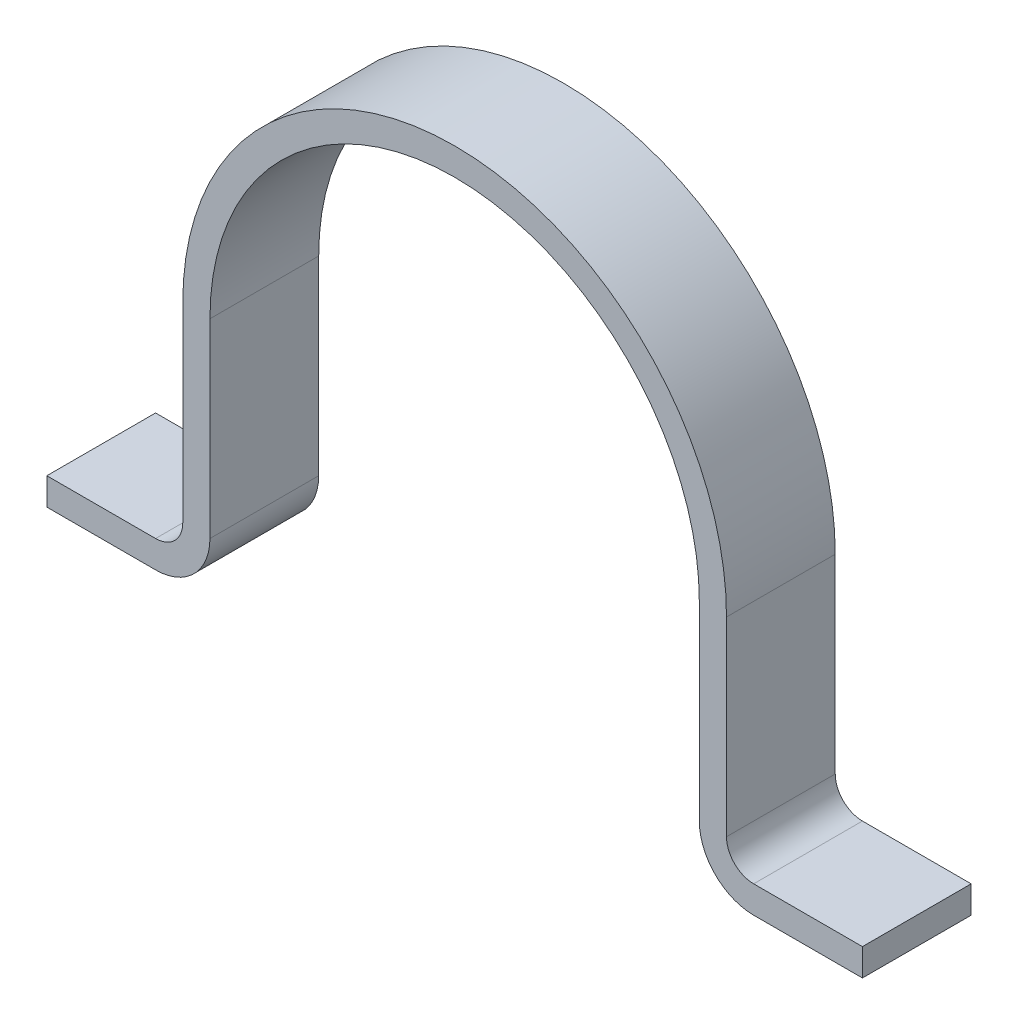
ISO-10303-21;
HEADER;
FILE_DESCRIPTION(('STEP AP214'),'2;1');
FILE_NAME('part.step','',(''),(''),'','','');
FILE_SCHEMA(('AUTOMOTIVE_DESIGN { 1 0 10303 214 1 1 1 1 }'));
ENDSEC;
DATA;
#1=APPLICATION_CONTEXT('core data for automotive mechanical design processes');
#2=APPLICATION_PROTOCOL_DEFINITION('international standard','automotive_design',2000,#1);
#3=PRODUCT_CONTEXT('',#1,'mechanical');
#4=PRODUCT('Part','Part','',(#3));
#5=PRODUCT_RELATED_PRODUCT_CATEGORY('part','',(#4));
#6=PRODUCT_DEFINITION_FORMATION('','',#4);
#7=PRODUCT_DEFINITION_CONTEXT('part definition',#1,'design');
#8=PRODUCT_DEFINITION('design','',#6,#7);
#9=PRODUCT_DEFINITION_SHAPE('','',#8);
#10=(LENGTH_UNIT() NAMED_UNIT(*) SI_UNIT(.MILLI.,.METRE.));
#11=(NAMED_UNIT(*) PLANE_ANGLE_UNIT() SI_UNIT($,.RADIAN.));
#12=(NAMED_UNIT(*) SI_UNIT($,.STERADIAN.) SOLID_ANGLE_UNIT());
#13=UNCERTAINTY_MEASURE_WITH_UNIT(LENGTH_MEASURE(1.E-05),#10,'distance_accuracy_value','');
#14=(GEOMETRIC_REPRESENTATION_CONTEXT(3) GLOBAL_UNCERTAINTY_ASSIGNED_CONTEXT((#13)) GLOBAL_UNIT_ASSIGNED_CONTEXT((#10,
#11,#12)) REPRESENTATION_CONTEXT('',''));
#15=CARTESIAN_POINT('',(0.,0.,0.));
#16=DIRECTION('',(0.,0.,1.));
#17=DIRECTION('',(1.,0.,0.));
#18=AXIS2_PLACEMENT_3D('',#15,#16,#17);
#19=CARTESIAN_POINT('',(22.5,0.0245064890224917,10.));
#20=DIRECTION('',(0.,0.,-1.));
#21=DIRECTION('',(-1.,0.,0.));
#22=AXIS2_PLACEMENT_3D('',#19,#20,#21);
#23=CYLINDRICAL_SURFACE('',#22,22.5000133459517);
#24=CARTESIAN_POINT('',(22.5,0.0245064890224917,0.));
#25=DIRECTION('',(0.,0.,-1.));
#26=DIRECTION('',(-1.,0.,0.));
#27=AXIS2_PLACEMENT_3D('',#24,#25,#26);
#28=CIRCLE('',#27,22.5000133459517);
#29=CARTESIAN_POINT('',(0.,0.,0.));
#30=VERTEX_POINT('',#29);
#31=CARTESIAN_POINT('',(45.,0.,0.));
#32=VERTEX_POINT('',#31);
#33=EDGE_CURVE('E177',#30,#32,#28,.T.);
#34=ORIENTED_EDGE('',*,*,#33,.T.);
#35=DIRECTION('',(0.,0.,-1.));
#36=VECTOR('',#35,1.);
#37=CARTESIAN_POINT('',(45.,0.,10.));
#38=LINE('',#37,#36);
#39=CARTESIAN_POINT('',(45.,0.,10.));
#40=VERTEX_POINT('',#39);
#41=EDGE_CURVE('E11',#40,#32,#38,.T.);
#42=ORIENTED_EDGE('',*,*,#41,.F.);
#43=CARTESIAN_POINT('',(22.5,0.0245064890224917,10.));
#44=DIRECTION('',(0.,0.,-1.));
#45=DIRECTION('',(-1.,0.,0.));
#46=AXIS2_PLACEMENT_3D('',#43,#44,#45);
#47=CIRCLE('',#46,22.5000133459517);
#48=CARTESIAN_POINT('',(0.,0.,10.));
#49=VERTEX_POINT('',#48);
#50=EDGE_CURVE('E207',#49,#40,#47,.T.);
#51=ORIENTED_EDGE('',*,*,#50,.F.);
#52=DIRECTION('',(0.,0.,-1.));
#53=VECTOR('',#52,1.);
#54=CARTESIAN_POINT('',(0.,0.,10.));
#55=LINE('',#54,#53);
#56=EDGE_CURVE('E173',#49,#30,#55,.T.);
#57=ORIENTED_EDGE('',*,*,#56,.T.);
#58=EDGE_LOOP('',(#34,#42,#51,#57));
#59=FACE_BOUND('',#58,.T.);
#60=ADVANCED_FACE('F33',(#59),#23,.F.);
#61=CARTESIAN_POINT('',(45.,0.,10.));
#62=DIRECTION('',(1.,0.,0.));
#63=DIRECTION('',(0.,1.,0.));
#64=AXIS2_PLACEMENT_3D('',#61,#62,#63);
#65=PLANE('',#64);
#66=DIRECTION('',(0.,-1.,0.));
#67=VECTOR('',#66,1.);
#68=CARTESIAN_POINT('',(45.,0.,0.));
#69=LINE('',#68,#67);
#70=CARTESIAN_POINT('',(45.,-17.5,0.));
#71=VERTEX_POINT('',#70);
#72=EDGE_CURVE('E180',#32,#71,#69,.T.);
#73=ORIENTED_EDGE('',*,*,#72,.T.);
#74=DIRECTION('',(0.,0.,-1.));
#75=VECTOR('',#74,1.);
#76=CARTESIAN_POINT('',(45.,-17.5,10.));
#77=LINE('',#76,#75);
#78=CARTESIAN_POINT('',(45.,-17.5,10.));
#79=VERTEX_POINT('',#78);
#80=EDGE_CURVE('E41',#79,#71,#77,.T.);
#81=ORIENTED_EDGE('',*,*,#80,.F.);
#82=DIRECTION('',(0.,-1.,0.));
#83=VECTOR('',#82,1.);
#84=CARTESIAN_POINT('',(45.,0.,10.));
#85=LINE('',#84,#83);
#86=EDGE_CURVE('E116',#40,#79,#85,.T.);
#87=ORIENTED_EDGE('',*,*,#86,.F.);
#88=ORIENTED_EDGE('',*,*,#41,.T.);
#89=EDGE_LOOP('',(#73,#81,#87,#88));
#90=FACE_BOUND('',#89,.T.);
#91=ADVANCED_FACE('F305',(#90),#65,.F.);
#92=CARTESIAN_POINT('',(50.,-17.5,10.));
#93=DIRECTION('',(0.,0.,-1.));
#94=DIRECTION('',(-1.,0.,0.));
#95=AXIS2_PLACEMENT_3D('',#92,#93,#94);
#96=CYLINDRICAL_SURFACE('',#95,5.);
#97=CARTESIAN_POINT('',(50.,-17.5,0.));
#98=DIRECTION('',(0.,0.,1.));
#99=DIRECTION('',(1.,0.,0.));
#100=AXIS2_PLACEMENT_3D('',#97,#98,#99);
#101=CIRCLE('',#100,5.);
#102=CARTESIAN_POINT('',(50.,-22.5,0.));
#103=VERTEX_POINT('',#102);
#104=EDGE_CURVE('E182',#71,#103,#101,.T.);
#105=ORIENTED_EDGE('',*,*,#104,.T.);
#106=DIRECTION('',(0.,0.,-1.));
#107=VECTOR('',#106,1.);
#108=CARTESIAN_POINT('',(50.,-22.5,10.));
#109=LINE('',#108,#107);
#110=CARTESIAN_POINT('',(50.,-22.5,10.));
#111=VERTEX_POINT('',#110);
#112=EDGE_CURVE('E238',#111,#103,#109,.T.);
#113=ORIENTED_EDGE('',*,*,#112,.F.);
#114=CARTESIAN_POINT('',(50.,-17.5,10.));
#115=DIRECTION('',(0.,0.,1.));
#116=DIRECTION('',(1.,0.,0.));
#117=AXIS2_PLACEMENT_3D('',#114,#115,#116);
#118=CIRCLE('',#117,5.);
#119=EDGE_CURVE('E246',#79,#111,#118,.T.);
#120=ORIENTED_EDGE('',*,*,#119,.F.);
#121=ORIENTED_EDGE('',*,*,#80,.T.);
#122=EDGE_LOOP('',(#105,#113,#120,#121));
#123=FACE_BOUND('',#122,.T.);
#124=ADVANCED_FACE('F244',(#123),#96,.T.);
#125=CARTESIAN_POINT('',(50.,-22.5,10.));
#126=DIRECTION('',(0.,1.,0.));
#127=DIRECTION('',(0.,0.,1.));
#128=AXIS2_PLACEMENT_3D('',#125,#126,#127);
#129=PLANE('',#128);
#130=DIRECTION('',(1.,0.,0.));
#131=VECTOR('',#130,1.);
#132=CARTESIAN_POINT('',(50.,-22.5,0.));
#133=LINE('',#132,#131);
#134=CARTESIAN_POINT('',(60.,-22.5,0.));
#135=VERTEX_POINT('',#134);
#136=EDGE_CURVE('E184',#103,#135,#133,.T.);
#137=ORIENTED_EDGE('',*,*,#136,.T.);
#138=DIRECTION('',(0.,0.,-1.));
#139=VECTOR('',#138,1.);
#140=CARTESIAN_POINT('',(60.,-22.5,10.));
#141=LINE('',#140,#139);
#142=CARTESIAN_POINT('',(60.,-22.5,10.));
#143=VERTEX_POINT('',#142);
#144=EDGE_CURVE('E235',#143,#135,#141,.T.);
#145=ORIENTED_EDGE('',*,*,#144,.F.);
#146=DIRECTION('',(1.,0.,0.));
#147=VECTOR('',#146,1.);
#148=CARTESIAN_POINT('',(50.,-22.5,10.));
#149=LINE('',#148,#147);
#150=EDGE_CURVE('E264',#111,#143,#149,.T.);
#151=ORIENTED_EDGE('',*,*,#150,.F.);
#152=ORIENTED_EDGE('',*,*,#112,.T.);
#153=EDGE_LOOP('',(#137,#145,#151,#152));
#154=FACE_BOUND('',#153,.T.);
#155=ADVANCED_FACE('F255',(#154),#129,.F.);
#156=CARTESIAN_POINT('',(60.,-22.5,10.));
#157=DIRECTION('',(-1.,0.,0.));
#158=DIRECTION('',(0.,0.,1.));
#159=AXIS2_PLACEMENT_3D('',#156,#157,#158);
#160=PLANE('',#159);
#161=DIRECTION('',(0.,1.,0.));
#162=VECTOR('',#161,1.);
#163=CARTESIAN_POINT('',(60.,-22.5,0.));
#164=LINE('',#163,#162);
#165=CARTESIAN_POINT('',(60.,-20.,0.));
#166=VERTEX_POINT('',#165);
#167=EDGE_CURVE('E186',#135,#166,#164,.T.);
#168=ORIENTED_EDGE('',*,*,#167,.T.);
#169=DIRECTION('',(0.,0.,-1.));
#170=VECTOR('',#169,1.);
#171=CARTESIAN_POINT('',(60.,-20.,10.));
#172=LINE('',#171,#170);
#173=CARTESIAN_POINT('',(60.,-20.,10.));
#174=VERTEX_POINT('',#173);
#175=EDGE_CURVE('E232',#174,#166,#172,.T.);
#176=ORIENTED_EDGE('',*,*,#175,.F.);
#177=DIRECTION('',(0.,1.,0.));
#178=VECTOR('',#177,1.);
#179=CARTESIAN_POINT('',(60.,-22.5,10.));
#180=LINE('',#179,#178);
#181=EDGE_CURVE('E261',#143,#174,#180,.T.);
#182=ORIENTED_EDGE('',*,*,#181,.F.);
#183=ORIENTED_EDGE('',*,*,#144,.T.);
#184=EDGE_LOOP('',(#168,#176,#182,#183));
#185=FACE_BOUND('',#184,.T.);
#186=ADVANCED_FACE('F259',(#185),#160,.F.);
#187=CARTESIAN_POINT('',(50.,-20.,10.));
#188=DIRECTION('',(0.,-1.,0.));
#189=DIRECTION('',(0.,0.,-1.));
#190=AXIS2_PLACEMENT_3D('',#187,#188,#189);
#191=PLANE('',#190);
#192=DIRECTION('',(-1.,0.,0.));
#193=VECTOR('',#192,1.);
#194=CARTESIAN_POINT('',(50.,-20.,0.));
#195=LINE('',#194,#193);
#196=CARTESIAN_POINT('',(50.,-20.,0.));
#197=VERTEX_POINT('',#196);
#198=EDGE_CURVE('E188',#166,#197,#195,.T.);
#199=ORIENTED_EDGE('',*,*,#198,.T.);
#200=DIRECTION('',(0.,0.,-1.));
#201=VECTOR('',#200,1.);
#202=CARTESIAN_POINT('',(50.,-20.,10.));
#203=LINE('',#202,#201);
#204=CARTESIAN_POINT('',(50.,-20.,10.));
#205=VERTEX_POINT('',#204);
#206=EDGE_CURVE('E229',#205,#197,#203,.T.);
#207=ORIENTED_EDGE('',*,*,#206,.F.);
#208=DIRECTION('',(-1.,0.,0.));
#209=VECTOR('',#208,1.);
#210=CARTESIAN_POINT('',(50.,-20.,10.));
#211=LINE('',#210,#209);
#212=EDGE_CURVE('E263',#174,#205,#211,.T.);
#213=ORIENTED_EDGE('',*,*,#212,.F.);
#214=ORIENTED_EDGE('',*,*,#175,.T.);
#215=EDGE_LOOP('',(#199,#207,#213,#214));
#216=FACE_BOUND('',#215,.T.);
#217=ADVANCED_FACE('F318',(#216),#191,.F.);
#218=CARTESIAN_POINT('',(50.,-17.5,10.));
#219=DIRECTION('',(0.,0.,-1.));
#220=DIRECTION('',(-1.,0.,0.));
#221=AXIS2_PLACEMENT_3D('',#218,#219,#220);
#222=CYLINDRICAL_SURFACE('',#221,2.5);
#223=CARTESIAN_POINT('',(50.,-17.5,0.));
#224=DIRECTION('',(0.,0.,-1.));
#225=DIRECTION('',(1.,0.,0.));
#226=AXIS2_PLACEMENT_3D('',#223,#224,#225);
#227=CIRCLE('',#226,2.5);
#228=CARTESIAN_POINT('',(47.5,-17.5,0.));
#229=VERTEX_POINT('',#228);
#230=EDGE_CURVE('E190',#197,#229,#227,.T.);
#231=ORIENTED_EDGE('',*,*,#230,.T.);
#232=DIRECTION('',(0.,0.,-1.));
#233=VECTOR('',#232,1.);
#234=CARTESIAN_POINT('',(47.5,-17.5,10.));
#235=LINE('',#234,#233);
#236=CARTESIAN_POINT('',(47.5,-17.5,10.));
#237=VERTEX_POINT('',#236);
#238=EDGE_CURVE('E226',#237,#229,#235,.T.);
#239=ORIENTED_EDGE('',*,*,#238,.F.);
#240=CARTESIAN_POINT('',(50.,-17.5,10.));
#241=DIRECTION('',(0.,0.,-1.));
#242=DIRECTION('',(1.,0.,0.));
#243=AXIS2_PLACEMENT_3D('',#240,#241,#242);
#244=CIRCLE('',#243,2.5);
#245=EDGE_CURVE('E266',#205,#237,#244,.T.);
#246=ORIENTED_EDGE('',*,*,#245,.F.);
#247=ORIENTED_EDGE('',*,*,#206,.T.);
#248=EDGE_LOOP('',(#231,#239,#246,#247));
#249=FACE_BOUND('',#248,.T.);
#250=ADVANCED_FACE('F321',(#249),#222,.F.);
#251=CARTESIAN_POINT('',(47.5,-0.0013256181794197,10.));
#252=DIRECTION('',(-1.,0.,0.));
#253=DIRECTION('',(0.,0.,1.));
#254=AXIS2_PLACEMENT_3D('',#251,#252,#253);
#255=PLANE('',#254);
#256=DIRECTION('',(0.,1.,0.));
#257=VECTOR('',#256,1.);
#258=CARTESIAN_POINT('',(47.5,-0.0013256181794197,0.));
#259=LINE('',#258,#257);
#260=CARTESIAN_POINT('',(47.5,-0.00132561817942583,0.));
#261=VERTEX_POINT('',#260);
#262=EDGE_CURVE('E192',#229,#261,#259,.T.);
#263=ORIENTED_EDGE('',*,*,#262,.T.);
#264=DIRECTION('',(0.,0.,-1.));
#265=VECTOR('',#264,1.);
#266=CARTESIAN_POINT('',(47.5,-0.00132561817942583,10.));
#267=LINE('',#266,#265);
#268=CARTESIAN_POINT('',(47.5,-0.00132561817942583,10.));
#269=VERTEX_POINT('',#268);
#270=EDGE_CURVE('E223',#269,#261,#267,.T.);
#271=ORIENTED_EDGE('',*,*,#270,.F.);
#272=DIRECTION('',(0.,1.,0.));
#273=VECTOR('',#272,1.);
#274=CARTESIAN_POINT('',(47.5,-0.0013256181794197,10.));
#275=LINE('',#274,#273);
#276=EDGE_CURVE('E272',#237,#269,#275,.T.);
#277=ORIENTED_EDGE('',*,*,#276,.F.);
#278=ORIENTED_EDGE('',*,*,#238,.T.);
#279=EDGE_LOOP('',(#263,#271,#277,#278));
#280=FACE_BOUND('',#279,.T.);
#281=ADVANCED_FACE('F325',(#280),#255,.F.);
#282=CARTESIAN_POINT('',(22.5,0.0245064890224917,10.));
#283=DIRECTION('',(0.,0.,-1.));
#284=DIRECTION('',(-1.,0.,0.));
#285=AXIS2_PLACEMENT_3D('',#282,#283,#284);
#286=CYLINDRICAL_SURFACE('',#285,25.0000133459517);
#287=CARTESIAN_POINT('',(22.5,0.0245064890224917,0.));
#288=DIRECTION('',(0.,0.,1.));
#289=DIRECTION('',(-1.,0.,0.));
#290=AXIS2_PLACEMENT_3D('',#287,#288,#289);
#291=CIRCLE('',#290,25.0000133459517);
#292=CARTESIAN_POINT('',(-2.5,-0.00132561818277739,0.));
#293=VERTEX_POINT('',#292);
#294=EDGE_CURVE('E194',#261,#293,#291,.T.);
#295=ORIENTED_EDGE('',*,*,#294,.T.);
#296=DIRECTION('',(0.,0.,-1.));
#297=VECTOR('',#296,1.);
#298=CARTESIAN_POINT('',(-2.5,-0.00132561818277739,10.));
#299=LINE('',#298,#297);
#300=CARTESIAN_POINT('',(-2.5,-0.00132561818277739,10.));
#301=VERTEX_POINT('',#300);
#302=EDGE_CURVE('E220',#301,#293,#299,.T.);
#303=ORIENTED_EDGE('',*,*,#302,.F.);
#304=CARTESIAN_POINT('',(22.5,0.0245064890224917,10.));
#305=DIRECTION('',(0.,0.,1.));
#306=DIRECTION('',(-1.,0.,0.));
#307=AXIS2_PLACEMENT_3D('',#304,#305,#306);
#308=CIRCLE('',#307,25.0000133459517);
#309=EDGE_CURVE('E274',#269,#301,#308,.T.);
#310=ORIENTED_EDGE('',*,*,#309,.F.);
#311=ORIENTED_EDGE('',*,*,#270,.T.);
#312=EDGE_LOOP('',(#295,#303,#310,#311));
#313=FACE_BOUND('',#312,.T.);
#314=ADVANCED_FACE('F329',(#313),#286,.T.);
#315=CARTESIAN_POINT('',(-2.5,-0.00132561818277739,10.));
#316=DIRECTION('',(1.,0.,0.));
#317=DIRECTION('',(0.,1.,0.));
#318=AXIS2_PLACEMENT_3D('',#315,#316,#317);
#319=PLANE('',#318);
#320=DIRECTION('',(0.,-1.,0.));
#321=VECTOR('',#320,1.);
#322=CARTESIAN_POINT('',(-2.5,-0.00132561818277739,0.));
#323=LINE('',#322,#321);
#324=CARTESIAN_POINT('',(-2.5,-17.5,0.));
#325=VERTEX_POINT('',#324);
#326=EDGE_CURVE('E196',#293,#325,#323,.T.);
#327=ORIENTED_EDGE('',*,*,#326,.T.);
#328=DIRECTION('',(0.,0.,-1.));
#329=VECTOR('',#328,1.);
#330=CARTESIAN_POINT('',(-2.5,-17.5,10.));
#331=LINE('',#330,#329);
#332=CARTESIAN_POINT('',(-2.5,-17.5,10.));
#333=VERTEX_POINT('',#332);
#334=EDGE_CURVE('E217',#333,#325,#331,.T.);
#335=ORIENTED_EDGE('',*,*,#334,.F.);
#336=DIRECTION('',(0.,-1.,0.));
#337=VECTOR('',#336,1.);
#338=CARTESIAN_POINT('',(-2.5,-0.00132561818277739,10.));
#339=LINE('',#338,#337);
#340=EDGE_CURVE('E276',#301,#333,#339,.T.);
#341=ORIENTED_EDGE('',*,*,#340,.F.);
#342=ORIENTED_EDGE('',*,*,#302,.T.);
#343=EDGE_LOOP('',(#327,#335,#341,#342));
#344=FACE_BOUND('',#343,.T.);
#345=ADVANCED_FACE('F333',(#344),#319,.F.);
#346=CARTESIAN_POINT('',(-5.,-17.5,10.));
#347=DIRECTION('',(0.,0.,-1.));
#348=DIRECTION('',(-1.,0.,0.));
#349=AXIS2_PLACEMENT_3D('',#346,#347,#348);
#350=CYLINDRICAL_SURFACE('',#349,2.5);
#351=CARTESIAN_POINT('',(-5.,-17.5,0.));
#352=DIRECTION('',(0.,0.,-1.));
#353=DIRECTION('',(-1.,0.,0.));
#354=AXIS2_PLACEMENT_3D('',#351,#352,#353);
#355=CIRCLE('',#354,2.5);
#356=CARTESIAN_POINT('',(-5.00000000000002,-20.,0.));
#357=VERTEX_POINT('',#356);
#358=EDGE_CURVE('E198',#325,#357,#355,.T.);
#359=ORIENTED_EDGE('',*,*,#358,.T.);
#360=DIRECTION('',(0.,0.,-1.));
#361=VECTOR('',#360,1.);
#362=CARTESIAN_POINT('',(-5.00000000000002,-20.,10.));
#363=LINE('',#362,#361);
#364=CARTESIAN_POINT('',(-5.00000000000002,-20.,10.));
#365=VERTEX_POINT('',#364);
#366=EDGE_CURVE('E214',#365,#357,#363,.T.);
#367=ORIENTED_EDGE('',*,*,#366,.F.);
#368=CARTESIAN_POINT('',(-5.,-17.5,10.));
#369=DIRECTION('',(0.,0.,-1.));
#370=DIRECTION('',(-1.,0.,0.));
#371=AXIS2_PLACEMENT_3D('',#368,#369,#370);
#372=CIRCLE('',#371,2.5);
#373=EDGE_CURVE('E278',#333,#365,#372,.T.);
#374=ORIENTED_EDGE('',*,*,#373,.F.);
#375=ORIENTED_EDGE('',*,*,#334,.T.);
#376=EDGE_LOOP('',(#359,#367,#374,#375));
#377=FACE_BOUND('',#376,.T.);
#378=ADVANCED_FACE('F337',(#377),#350,.F.);
#379=CARTESIAN_POINT('',(-5.00000000000002,-20.,10.));
#380=DIRECTION('',(0.,-1.,0.));
#381=DIRECTION('',(1.,0.,0.));
#382=AXIS2_PLACEMENT_3D('',#379,#380,#381);
#383=PLANE('',#382);
#384=DIRECTION('',(-1.,0.,0.));
#385=VECTOR('',#384,1.);
#386=CARTESIAN_POINT('',(-5.00000000000002,-20.,0.));
#387=LINE('',#386,#385);
#388=CARTESIAN_POINT('',(-15.,-20.,0.));
#389=VERTEX_POINT('',#388);
#390=EDGE_CURVE('E200',#357,#389,#387,.T.);
#391=ORIENTED_EDGE('',*,*,#390,.T.);
#392=DIRECTION('',(0.,0.,-1.));
#393=VECTOR('',#392,1.);
#394=CARTESIAN_POINT('',(-15.,-20.,10.));
#395=LINE('',#394,#393);
#396=CARTESIAN_POINT('',(-15.,-20.,10.));
#397=VERTEX_POINT('',#396);
#398=EDGE_CURVE('E211',#397,#389,#395,.T.);
#399=ORIENTED_EDGE('',*,*,#398,.F.);
#400=DIRECTION('',(-1.,0.,0.));
#401=VECTOR('',#400,1.);
#402=CARTESIAN_POINT('',(-5.00000000000002,-20.,10.));
#403=LINE('',#402,#401);
#404=EDGE_CURVE('E280',#365,#397,#403,.T.);
#405=ORIENTED_EDGE('',*,*,#404,.F.);
#406=ORIENTED_EDGE('',*,*,#366,.T.);
#407=EDGE_LOOP('',(#391,#399,#405,#406));
#408=FACE_BOUND('',#407,.T.);
#409=ADVANCED_FACE('F286',(#408),#383,.F.);
#410=CARTESIAN_POINT('',(-15.,-22.5,10.));
#411=DIRECTION('',(1.,0.,0.));
#412=DIRECTION('',(0.,0.,-1.));
#413=AXIS2_PLACEMENT_3D('',#410,#411,#412);
#414=PLANE('',#413);
#415=DIRECTION('',(0.,-1.,0.));
#416=VECTOR('',#415,1.);
#417=CARTESIAN_POINT('',(-15.,-22.5,0.));
#418=LINE('',#417,#416);
#419=CARTESIAN_POINT('',(-15.,-22.5,0.));
#420=VERTEX_POINT('',#419);
#421=EDGE_CURVE('E202',#389,#420,#418,.T.);
#422=ORIENTED_EDGE('',*,*,#421,.T.);
#423=DIRECTION('',(0.,0.,-1.));
#424=VECTOR('',#423,1.);
#425=CARTESIAN_POINT('',(-15.,-22.5,10.));
#426=LINE('',#425,#424);
#427=CARTESIAN_POINT('',(-15.,-22.5,10.));
#428=VERTEX_POINT('',#427);
#429=EDGE_CURVE('E168',#428,#420,#426,.T.);
#430=ORIENTED_EDGE('',*,*,#429,.F.);
#431=DIRECTION('',(0.,-1.,0.));
#432=VECTOR('',#431,1.);
#433=CARTESIAN_POINT('',(-15.,-22.5,10.));
#434=LINE('',#433,#432);
#435=EDGE_CURVE('E159',#397,#428,#434,.T.);
#436=ORIENTED_EDGE('',*,*,#435,.F.);
#437=ORIENTED_EDGE('',*,*,#398,.T.);
#438=EDGE_LOOP('',(#422,#430,#436,#437));
#439=FACE_BOUND('',#438,.T.);
#440=ADVANCED_FACE('F290',(#439),#414,.F.);
#441=CARTESIAN_POINT('',(-5.00000000000003,-22.5,10.));
#442=DIRECTION('',(0.,1.,0.));
#443=DIRECTION('',(-1.,0.,0.));
#444=AXIS2_PLACEMENT_3D('',#441,#442,#443);
#445=PLANE('',#444);
#446=DIRECTION('',(1.,0.,0.));
#447=VECTOR('',#446,1.);
#448=CARTESIAN_POINT('',(-5.00000000000003,-22.5,0.));
#449=LINE('',#448,#447);
#450=CARTESIAN_POINT('',(-5.00000000000003,-22.5,0.));
#451=VERTEX_POINT('',#450);
#452=EDGE_CURVE('E167',#420,#451,#449,.T.);
#453=ORIENTED_EDGE('',*,*,#452,.T.);
#454=DIRECTION('',(0.,0.,-1.));
#455=VECTOR('',#454,1.);
#456=CARTESIAN_POINT('',(-5.00000000000003,-22.5,10.));
#457=LINE('',#456,#455);
#458=CARTESIAN_POINT('',(-5.00000000000003,-22.5,10.));
#459=VERTEX_POINT('',#458);
#460=EDGE_CURVE('E164',#459,#451,#457,.T.);
#461=ORIENTED_EDGE('',*,*,#460,.F.);
#462=DIRECTION('',(1.,0.,0.));
#463=VECTOR('',#462,1.);
#464=CARTESIAN_POINT('',(-5.00000000000003,-22.5,10.));
#465=LINE('',#464,#463);
#466=EDGE_CURVE('E153',#428,#459,#465,.T.);
#467=ORIENTED_EDGE('',*,*,#466,.F.);
#468=ORIENTED_EDGE('',*,*,#429,.T.);
#469=EDGE_LOOP('',(#453,#461,#467,#468));
#470=FACE_BOUND('',#469,.T.);
#471=ADVANCED_FACE('F165',(#470),#445,.F.);
#472=CARTESIAN_POINT('',(-5.,-17.5,10.));
#473=DIRECTION('',(0.,0.,-1.));
#474=DIRECTION('',(-1.,0.,0.));
#475=AXIS2_PLACEMENT_3D('',#472,#473,#474);
#476=CYLINDRICAL_SURFACE('',#475,5.);
#477=CARTESIAN_POINT('',(-5.,-17.5,0.));
#478=DIRECTION('',(0.,0.,1.));
#479=DIRECTION('',(-1.,0.,0.));
#480=AXIS2_PLACEMENT_3D('',#477,#478,#479);
#481=CIRCLE('',#480,5.);
#482=CARTESIAN_POINT('',(0.,-17.5,0.));
#483=VERTEX_POINT('',#482);
#484=EDGE_CURVE('E102',#451,#483,#481,.T.);
#485=ORIENTED_EDGE('',*,*,#484,.T.);
#486=DIRECTION('',(0.,0.,-1.));
#487=VECTOR('',#486,1.);
#488=CARTESIAN_POINT('',(0.,-17.5,10.));
#489=LINE('',#488,#487);
#490=CARTESIAN_POINT('',(0.,-17.5,10.));
#491=VERTEX_POINT('',#490);
#492=EDGE_CURVE('E169',#491,#483,#489,.T.);
#493=ORIENTED_EDGE('',*,*,#492,.F.);
#494=CARTESIAN_POINT('',(-5.,-17.5,10.));
#495=DIRECTION('',(0.,0.,1.));
#496=DIRECTION('',(-1.,0.,0.));
#497=AXIS2_PLACEMENT_3D('',#494,#495,#496);
#498=CIRCLE('',#497,5.);
#499=EDGE_CURVE('E157',#459,#491,#498,.T.);
#500=ORIENTED_EDGE('',*,*,#499,.F.);
#501=ORIENTED_EDGE('',*,*,#460,.T.);
#502=EDGE_LOOP('',(#485,#493,#500,#501));
#503=FACE_BOUND('',#502,.T.);
#504=ADVANCED_FACE('F171',(#503),#476,.T.);
#505=CARTESIAN_POINT('',(0.,0.,10.));
#506=DIRECTION('',(-1.,0.,0.));
#507=DIRECTION('',(0.,-1.,0.));
#508=AXIS2_PLACEMENT_3D('',#505,#506,#507);
#509=PLANE('',#508);
#510=DIRECTION('',(0.,1.,0.));
#511=VECTOR('',#510,1.);
#512=CARTESIAN_POINT('',(0.,0.,0.));
#513=LINE('',#512,#511);
#514=EDGE_CURVE('E108',#483,#30,#513,.T.);
#515=ORIENTED_EDGE('',*,*,#514,.T.);
#516=ORIENTED_EDGE('',*,*,#56,.F.);
#517=DIRECTION('',(0.,1.,0.));
#518=VECTOR('',#517,1.);
#519=CARTESIAN_POINT('',(0.,0.,10.));
#520=LINE('',#519,#518);
#521=EDGE_CURVE('E49',#491,#49,#520,.T.);
#522=ORIENTED_EDGE('',*,*,#521,.F.);
#523=ORIENTED_EDGE('',*,*,#492,.T.);
#524=EDGE_LOOP('',(#515,#516,#522,#523));
#525=FACE_BOUND('',#524,.T.);
#526=ADVANCED_FACE('F294',(#525),#509,.F.);
#527=CARTESIAN_POINT('',(22.5,0.0245064890224917,10.));
#528=DIRECTION('',(0.,0.,-1.));
#529=DIRECTION('',(-1.,0.,0.));
#530=AXIS2_PLACEMENT_3D('',#527,#528,#529);
#531=PLANE('',#530);
#532=ORIENTED_EDGE('',*,*,#50,.T.);
#533=ORIENTED_EDGE('',*,*,#86,.T.);
#534=ORIENTED_EDGE('',*,*,#119,.T.);
#535=ORIENTED_EDGE('',*,*,#150,.T.);
#536=ORIENTED_EDGE('',*,*,#181,.T.);
#537=ORIENTED_EDGE('',*,*,#212,.T.);
#538=ORIENTED_EDGE('',*,*,#245,.T.);
#539=ORIENTED_EDGE('',*,*,#276,.T.);
#540=ORIENTED_EDGE('',*,*,#309,.T.);
#541=ORIENTED_EDGE('',*,*,#340,.T.);
#542=ORIENTED_EDGE('',*,*,#373,.T.);
#543=ORIENTED_EDGE('',*,*,#404,.T.);
#544=ORIENTED_EDGE('',*,*,#435,.T.);
#545=ORIENTED_EDGE('',*,*,#466,.T.);
#546=ORIENTED_EDGE('',*,*,#499,.T.);
#547=ORIENTED_EDGE('',*,*,#521,.T.);
#548=EDGE_LOOP('',(#532,#533,#534,#535,#536,#537,#538,#539,#540,#541,#542,#543,#544,#545,#546,#547));
#549=FACE_BOUND('',#548,.T.);
#550=ADVANCED_FACE('F155',(#549),#531,.F.);
#551=CARTESIAN_POINT('',(22.5,0.0245064890224917,0.));
#552=DIRECTION('',(0.,0.,-1.));
#553=DIRECTION('',(-1.,0.,0.));
#554=AXIS2_PLACEMENT_3D('',#551,#552,#553);
#555=PLANE('',#554);
#556=ORIENTED_EDGE('',*,*,#33,.F.);
#557=ORIENTED_EDGE('',*,*,#514,.F.);
#558=ORIENTED_EDGE('',*,*,#484,.F.);
#559=ORIENTED_EDGE('',*,*,#452,.F.);
#560=ORIENTED_EDGE('',*,*,#421,.F.);
#561=ORIENTED_EDGE('',*,*,#390,.F.);
#562=ORIENTED_EDGE('',*,*,#358,.F.);
#563=ORIENTED_EDGE('',*,*,#326,.F.);
#564=ORIENTED_EDGE('',*,*,#294,.F.);
#565=ORIENTED_EDGE('',*,*,#262,.F.);
#566=ORIENTED_EDGE('',*,*,#230,.F.);
#567=ORIENTED_EDGE('',*,*,#198,.F.);
#568=ORIENTED_EDGE('',*,*,#167,.F.);
#569=ORIENTED_EDGE('',*,*,#136,.F.);
#570=ORIENTED_EDGE('',*,*,#104,.F.);
#571=ORIENTED_EDGE('',*,*,#72,.F.);
#572=EDGE_LOOP('',(#556,#557,#558,#559,#560,#561,#562,#563,#564,#565,#566,#567,#568,#569,#570,#571));
#573=FACE_BOUND('',#572,.T.);
#574=ADVANCED_FACE('F250',(#573),#555,.T.);
#575=CLOSED_SHELL('',(#60,#91,#124,#155,#186,#217,#250,#281,#314,#345,#378,#409,#440,#471,#504,
#526,#550,#574));
#576=MANIFOLD_SOLID_BREP('B2',#575);
#577=ADVANCED_BREP_SHAPE_REPRESENTATION('',(#18,#576),#14);
#578=SHAPE_DEFINITION_REPRESENTATION(#9,#577);
ENDSEC;
END-ISO-10303-21;
